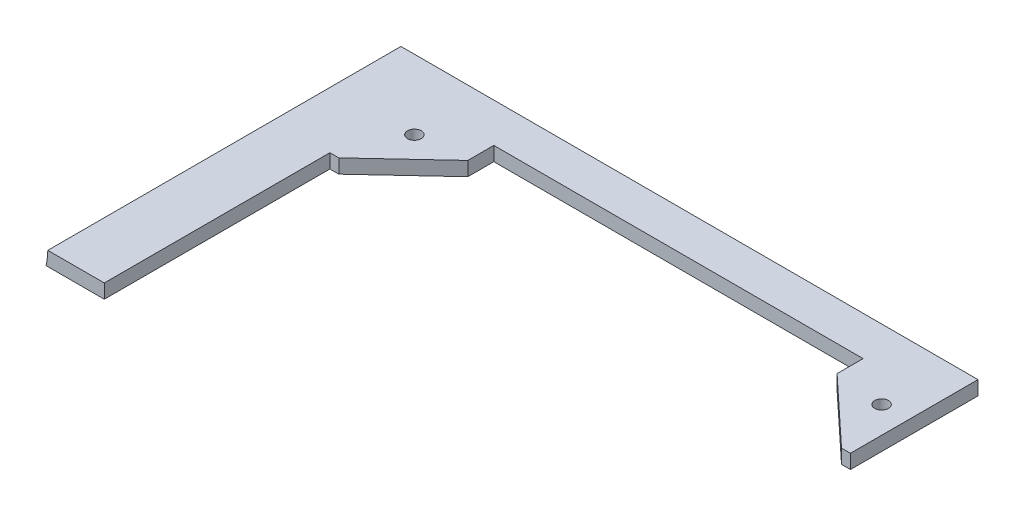
ISO-10303-21;
HEADER;
FILE_DESCRIPTION(('STEP AP214'),'2;1');
FILE_NAME('part.step','',(''),(''),'','','');
FILE_SCHEMA(('AUTOMOTIVE_DESIGN { 1 0 10303 214 1 1 1 1 }'));
ENDSEC;
DATA;
#1=APPLICATION_CONTEXT('core data for automotive mechanical design processes');
#2=APPLICATION_PROTOCOL_DEFINITION('international standard','automotive_design',2000,#1);
#3=PRODUCT_CONTEXT('',#1,'mechanical');
#4=PRODUCT('Part','Part','',(#3));
#5=PRODUCT_RELATED_PRODUCT_CATEGORY('part','',(#4));
#6=PRODUCT_DEFINITION_FORMATION('','',#4);
#7=PRODUCT_DEFINITION_CONTEXT('part definition',#1,'design');
#8=PRODUCT_DEFINITION('design','',#6,#7);
#9=PRODUCT_DEFINITION_SHAPE('','',#8);
#10=(LENGTH_UNIT() NAMED_UNIT(*) SI_UNIT(.MILLI.,.METRE.));
#11=(NAMED_UNIT(*) PLANE_ANGLE_UNIT() SI_UNIT($,.RADIAN.));
#12=(NAMED_UNIT(*) SI_UNIT($,.STERADIAN.) SOLID_ANGLE_UNIT());
#13=UNCERTAINTY_MEASURE_WITH_UNIT(LENGTH_MEASURE(1.E-05),#10,'distance_accuracy_value','');
#14=(GEOMETRIC_REPRESENTATION_CONTEXT(3) GLOBAL_UNCERTAINTY_ASSIGNED_CONTEXT((#13)) GLOBAL_UNIT_ASSIGNED_CONTEXT((#10,
#11,#12)) REPRESENTATION_CONTEXT('',''));
#15=CARTESIAN_POINT('',(0.,0.,0.));
#16=DIRECTION('',(0.,0.,1.));
#17=DIRECTION('',(1.,0.,0.));
#18=AXIS2_PLACEMENT_3D('',#15,#16,#17);
#19=CARTESIAN_POINT('',(0.,3.175,0.));
#20=DIRECTION('',(0.,-1.,0.));
#21=DIRECTION('',(0.,0.,-1.));
#22=AXIS2_PLACEMENT_3D('',#19,#20,#21);
#23=PLANE('',#22);
#24=CARTESIAN_POINT('',(-52.505245515811,3.175,-25.6052455158436));
#25=DIRECTION('',(0.,1.,0.));
#26=DIRECTION('',(0.,0.,1.));
#27=AXIS2_PLACEMENT_3D('',#24,#25,#26);
#28=CIRCLE('',#27,1.54533666301317);
#29=CARTESIAN_POINT('',(-52.505245515811,3.175,-24.0599088528304));
#30=VERTEX_POINT('',#29);
#31=EDGE_CURVE('E310',#30,#30,#28,.T.);
#32=ORIENTED_EDGE('',*,*,#31,.F.);
#33=EDGE_LOOP('',(#32));
#34=FACE_BOUND('',#33,.T.);
#35=CARTESIAN_POINT('',(52.5000000000001,3.175,-25.6052455158436));
#36=DIRECTION('',(0.,1.,0.));
#37=DIRECTION('',(0.,0.,1.));
#38=AXIS2_PLACEMENT_3D('',#35,#36,#37);
#39=CIRCLE('',#38,1.54533666301317);
#40=CARTESIAN_POINT('',(52.5000000000001,3.175,-24.0599088528304));
#41=VERTEX_POINT('',#40);
#42=EDGE_CURVE('E319',#41,#41,#39,.T.);
#43=ORIENTED_EDGE('',*,*,#42,.F.);
#44=EDGE_LOOP('',(#43));
#45=FACE_BOUND('',#44,.T.);
#46=DIRECTION('',(0.,0.,-1.));
#47=VECTOR('',#46,1.);
#48=CARTESIAN_POINT('',(-71.1999999999997,3.175,467.88391263662));
#49=LINE('',#48,#47);
#50=CARTESIAN_POINT('',(-71.1999999999999,3.175,38.1));
#51=VERTEX_POINT('',#50);
#52=CARTESIAN_POINT('',(-71.1999999999999,3.17500000006794,-36.6546307938387));
#53=VERTEX_POINT('',#52);
#54=EDGE_CURVE('E275',#51,#53,#49,.T.);
#55=ORIENTED_EDGE('',*,*,#54,.F.);
#56=DIRECTION('',(1.,0.,0.));
#57=VECTOR('',#56,1.);
#58=CARTESIAN_POINT('',(-76.2,3.175,38.1));
#59=LINE('',#58,#57);
#60=CARTESIAN_POINT('',(-58.4999999999998,3.175,38.1));
#61=VERTEX_POINT('',#60);
#62=EDGE_CURVE('E416',#51,#61,#59,.T.);
#63=ORIENTED_EDGE('',*,*,#62,.T.);
#64=DIRECTION('',(0.,0.,1.));
#65=VECTOR('',#64,1.);
#66=CARTESIAN_POINT('',(-58.4999999999998,3.175,0.));
#67=LINE('',#66,#65);
#68=CARTESIAN_POINT('',(-58.4999999999998,3.175,-12.6000000000291));
#69=VERTEX_POINT('',#68);
#70=EDGE_CURVE('E360',#69,#61,#67,.T.);
#71=ORIENTED_EDGE('',*,*,#70,.F.);
#72=DIRECTION('',(-1.,0.,0.));
#73=VECTOR('',#72,1.);
#74=CARTESIAN_POINT('',(0.,3.175,-12.6000000000289));
#75=LINE('',#74,#73);
#76=CARTESIAN_POINT('',(-56.4999999999998,3.175,-12.6000000000291));
#77=VERTEX_POINT('',#76);
#78=EDGE_CURVE('E314',#77,#69,#75,.T.);
#79=ORIENTED_EDGE('',*,*,#78,.F.);
#80=DIRECTION('',(0.731055268242868,0.,-0.682318250360012));
#81=VECTOR('',#80,1.);
#82=CARTESIAN_POINT('',(-32.5890736342187,3.175,-34.9168646080915));
#83=LINE('',#82,#81);
#84=CARTESIAN_POINT('',(-41.4999999999998,3.175,-26.6000000000291));
#85=VERTEX_POINT('',#84);
#86=EDGE_CURVE('E331',#77,#85,#83,.T.);
#87=ORIENTED_EDGE('',*,*,#86,.T.);
#88=DIRECTION('',(0.,0.,-1.));
#89=VECTOR('',#88,1.);
#90=CARTESIAN_POINT('',(-41.4999999999998,3.175,0.));
#91=LINE('',#90,#89);
#92=CARTESIAN_POINT('',(-41.4999999999998,3.175,-32.4500000000291));
#93=VERTEX_POINT('',#92);
#94=EDGE_CURVE('E383',#85,#93,#91,.T.);
#95=ORIENTED_EDGE('',*,*,#94,.T.);
#96=DIRECTION('',(1.,0.,0.));
#97=VECTOR('',#96,1.);
#98=CARTESIAN_POINT('',(0.,3.175,-32.4500000000291));
#99=LINE('',#98,#97);
#100=CARTESIAN_POINT('',(41.5000000000002,3.175,-32.4500000000291));
#101=VERTEX_POINT('',#100);
#102=EDGE_CURVE('E379',#93,#101,#99,.T.);
#103=ORIENTED_EDGE('',*,*,#102,.T.);
#104=DIRECTION('',(0.,0.,1.));
#105=VECTOR('',#104,1.);
#106=CARTESIAN_POINT('',(41.5000000000002,3.175,0.));
#107=LINE('',#106,#105);
#108=CARTESIAN_POINT('',(41.5000000000002,3.175,-26.6000000000291));
#109=VERTEX_POINT('',#108);
#110=EDGE_CURVE('E375',#101,#109,#107,.T.);
#111=ORIENTED_EDGE('',*,*,#110,.T.);
#112=DIRECTION('',(0.731055268242869,0.,0.682318250360011));
#113=VECTOR('',#112,1.);
#114=CARTESIAN_POINT('',(32.5890736342188,3.175,-34.9168646080917));
#115=LINE('',#114,#113);
#116=CARTESIAN_POINT('',(56.5000000000002,3.175,-12.6000000000291));
#117=VERTEX_POINT('',#116);
#118=EDGE_CURVE('E371',#109,#117,#115,.T.);
#119=ORIENTED_EDGE('',*,*,#118,.T.);
#120=DIRECTION('',(1.,0.,0.));
#121=VECTOR('',#120,1.);
#122=CARTESIAN_POINT('',(0.,3.175,-12.6000000000291));
#123=LINE('',#122,#121);
#124=CARTESIAN_POINT('',(58.5000000000002,3.175,-12.6000000000291));
#125=VERTEX_POINT('',#124);
#126=EDGE_CURVE('E367',#117,#125,#123,.T.);
#127=ORIENTED_EDGE('',*,*,#126,.T.);
#128=DIRECTION('',(0.,0.,-1.));
#129=VECTOR('',#128,1.);
#130=CARTESIAN_POINT('',(58.5000000000002,3.175,0.));
#131=LINE('',#130,#129);
#132=CARTESIAN_POINT('',(58.5000000000002,3.175,-41.275));
#133=VERTEX_POINT('',#132);
#134=EDGE_CURVE('E364',#125,#133,#131,.T.);
#135=ORIENTED_EDGE('',*,*,#134,.T.);
#136=DIRECTION('',(1.,0.,0.));
#137=VECTOR('',#136,1.);
#138=CARTESIAN_POINT('',(-76.2,3.175,-41.275));
#139=LINE('',#138,#137);
#140=CARTESIAN_POINT('',(-71.2,3.175,-41.275));
#141=VERTEX_POINT('',#140);
#142=EDGE_CURVE('E282',#141,#133,#139,.T.);
#143=ORIENTED_EDGE('',*,*,#142,.F.);
#144=DIRECTION('',(0.,0.,-1.));
#145=VECTOR('',#144,1.);
#146=CARTESIAN_POINT('',(-71.2,3.175,-36.6546307938386));
#147=LINE('',#146,#145);
#148=EDGE_CURVE('E193',#53,#141,#147,.T.);
#149=ORIENTED_EDGE('',*,*,#148,.F.);
#150=EDGE_LOOP('',(#55,#63,#71,#79,#87,#95,#103,#111,#119,#127,#135,#143,#149));
#151=FACE_BOUND('',#150,.T.);
#152=ADVANCED_FACE('F177',(#34,#45,#151),#23,.F.);
#153=CARTESIAN_POINT('',(0.,0.,0.));
#154=DIRECTION('',(0.,-1.,0.));
#155=DIRECTION('',(0.,0.,-1.));
#156=AXIS2_PLACEMENT_3D('',#153,#154,#155);
#157=PLANE('',#156);
#158=CARTESIAN_POINT('',(52.5000000000001,0.,-25.6052455158436));
#159=DIRECTION('',(0.,1.,0.));
#160=DIRECTION('',(0.,0.,1.));
#161=AXIS2_PLACEMENT_3D('',#158,#159,#160);
#162=CIRCLE('',#161,1.54533666301317);
#163=CARTESIAN_POINT('',(52.5000000000001,0.,-24.0599088528304));
#164=VERTEX_POINT('',#163);
#165=EDGE_CURVE('E309',#164,#164,#162,.T.);
#166=ORIENTED_EDGE('',*,*,#165,.T.);
#167=EDGE_LOOP('',(#166));
#168=FACE_BOUND('',#167,.T.);
#169=CARTESIAN_POINT('',(-52.505245515811,0.,-25.6052455158436));
#170=DIRECTION('',(0.,1.,0.));
#171=DIRECTION('',(0.,0.,1.));
#172=AXIS2_PLACEMENT_3D('',#169,#170,#171);
#173=CIRCLE('',#172,1.54533666301317);
#174=CARTESIAN_POINT('',(-52.505245515811,0.,-24.0599088528304));
#175=VERTEX_POINT('',#174);
#176=EDGE_CURVE('E315',#175,#175,#173,.T.);
#177=ORIENTED_EDGE('',*,*,#176,.T.);
#178=EDGE_LOOP('',(#177));
#179=FACE_BOUND('',#178,.T.);
#180=DIRECTION('',(1.,0.,0.));
#181=VECTOR('',#180,1.);
#182=CARTESIAN_POINT('',(-76.2,0.,38.1));
#183=LINE('',#182,#181);
#184=CARTESIAN_POINT('',(-71.6032778758089,0.,38.1));
#185=VERTEX_POINT('',#184);
#186=CARTESIAN_POINT('',(-58.4999999999998,0.,38.1));
#187=VERTEX_POINT('',#186);
#188=EDGE_CURVE('E201',#185,#187,#183,.T.);
#189=ORIENTED_EDGE('',*,*,#188,.F.);
#190=DIRECTION('',(0.,0.,-1.));
#191=VECTOR('',#190,1.);
#192=CARTESIAN_POINT('',(-71.6032778758086,0.,467.88391263662));
#193=LINE('',#192,#191);
#194=CARTESIAN_POINT('',(-71.6032778758089,0.,-36.6546307938387));
#195=VERTEX_POINT('',#194);
#196=EDGE_CURVE('E283',#185,#195,#193,.T.);
#197=ORIENTED_EDGE('',*,*,#196,.T.);
#198=DIRECTION('',(0.,0.,-1.));
#199=VECTOR('',#198,1.);
#200=CARTESIAN_POINT('',(-71.603277875809,0.,-36.6546307938386));
#201=LINE('',#200,#199);
#202=CARTESIAN_POINT('',(-71.603277875809,0.,-41.275));
#203=VERTEX_POINT('',#202);
#204=EDGE_CURVE('E287',#195,#203,#201,.T.);
#205=ORIENTED_EDGE('',*,*,#204,.T.);
#206=DIRECTION('',(-1.,0.,0.));
#207=VECTOR('',#206,1.);
#208=CARTESIAN_POINT('',(58.5000000000002,0.,-41.275));
#209=LINE('',#208,#207);
#210=CARTESIAN_POINT('',(58.5000000000002,0.,-41.275));
#211=VERTEX_POINT('',#210);
#212=EDGE_CURVE('E305',#211,#203,#209,.T.);
#213=ORIENTED_EDGE('',*,*,#212,.F.);
#214=DIRECTION('',(0.,0.,-1.));
#215=VECTOR('',#214,1.);
#216=CARTESIAN_POINT('',(58.5000000000002,0.,0.));
#217=LINE('',#216,#215);
#218=CARTESIAN_POINT('',(58.5000000000002,0.,-12.6000000000291));
#219=VERTEX_POINT('',#218);
#220=EDGE_CURVE('E335',#219,#211,#217,.T.);
#221=ORIENTED_EDGE('',*,*,#220,.F.);
#222=DIRECTION('',(1.,0.,0.));
#223=VECTOR('',#222,1.);
#224=CARTESIAN_POINT('',(0.,0.,-12.6000000000291));
#225=LINE('',#224,#223);
#226=CARTESIAN_POINT('',(56.5000000000002,0.,-12.6000000000291));
#227=VERTEX_POINT('',#226);
#228=EDGE_CURVE('E338',#227,#219,#225,.T.);
#229=ORIENTED_EDGE('',*,*,#228,.F.);
#230=DIRECTION('',(0.731055268242869,0.,0.682318250360011));
#231=VECTOR('',#230,1.);
#232=CARTESIAN_POINT('',(32.5890736342188,0.,-34.9168646080917));
#233=LINE('',#232,#231);
#234=CARTESIAN_POINT('',(41.5000000000002,0.,-26.6000000000291));
#235=VERTEX_POINT('',#234);
#236=EDGE_CURVE('E341',#235,#227,#233,.T.);
#237=ORIENTED_EDGE('',*,*,#236,.F.);
#238=DIRECTION('',(0.,0.,1.));
#239=VECTOR('',#238,1.);
#240=CARTESIAN_POINT('',(41.5000000000002,0.,0.));
#241=LINE('',#240,#239);
#242=CARTESIAN_POINT('',(41.5000000000002,0.,-32.4500000000291));
#243=VERTEX_POINT('',#242);
#244=EDGE_CURVE('E344',#243,#235,#241,.T.);
#245=ORIENTED_EDGE('',*,*,#244,.F.);
#246=DIRECTION('',(1.,0.,0.));
#247=VECTOR('',#246,1.);
#248=CARTESIAN_POINT('',(0.,0.,-32.4500000000291));
#249=LINE('',#248,#247);
#250=CARTESIAN_POINT('',(-41.4999999999998,0.,-32.4500000000291));
#251=VERTEX_POINT('',#250);
#252=EDGE_CURVE('E347',#251,#243,#249,.T.);
#253=ORIENTED_EDGE('',*,*,#252,.F.);
#254=DIRECTION('',(0.,0.,-1.));
#255=VECTOR('',#254,1.);
#256=CARTESIAN_POINT('',(-41.4999999999998,0.,0.));
#257=LINE('',#256,#255);
#258=CARTESIAN_POINT('',(-41.4999999999998,0.,-26.6000000000291));
#259=VERTEX_POINT('',#258);
#260=EDGE_CURVE('E350',#259,#251,#257,.T.);
#261=ORIENTED_EDGE('',*,*,#260,.F.);
#262=DIRECTION('',(0.731055268242868,0.,-0.682318250360012));
#263=VECTOR('',#262,1.);
#264=CARTESIAN_POINT('',(-32.5890736342187,0.,-34.9168646080915));
#265=LINE('',#264,#263);
#266=CARTESIAN_POINT('',(-56.4999999999998,0.,-12.6000000000291));
#267=VERTEX_POINT('',#266);
#268=EDGE_CURVE('E353',#267,#259,#265,.T.);
#269=ORIENTED_EDGE('',*,*,#268,.F.);
#270=DIRECTION('',(-1.,0.,0.));
#271=VECTOR('',#270,1.);
#272=CARTESIAN_POINT('',(0.,0.,-12.6000000000289));
#273=LINE('',#272,#271);
#274=CARTESIAN_POINT('',(-58.4999999999998,0.,-12.6000000000291));
#275=VERTEX_POINT('',#274);
#276=EDGE_CURVE('E326',#267,#275,#273,.T.);
#277=ORIENTED_EDGE('',*,*,#276,.T.);
#278=DIRECTION('',(0.,0.,1.));
#279=VECTOR('',#278,1.);
#280=CARTESIAN_POINT('',(-58.4999999999998,0.,0.));
#281=LINE('',#280,#279);
#282=EDGE_CURVE('E330',#275,#187,#281,.T.);
#283=ORIENTED_EDGE('',*,*,#282,.T.);
#284=EDGE_LOOP('',(#189,#197,#205,#213,#221,#229,#237,#245,#253,#261,#269,#277,#283));
#285=FACE_BOUND('',#284,.T.);
#286=ADVANCED_FACE('F425',(#168,#179,#285),#157,.T.);
#287=CARTESIAN_POINT('',(-76.2,3.175,38.1));
#288=DIRECTION('',(0.,0.,-1.));
#289=DIRECTION('',(-1.,0.,0.));
#290=AXIS2_PLACEMENT_3D('',#287,#288,#289);
#291=PLANE('',#290);
#292=CARTESIAN_POINT('',(-83.8999999999999,3.17500000006792,38.1));
#293=DIRECTION('',(0.,0.,-1.));
#294=DIRECTION('',(-1.,0.,0.));
#295=AXIS2_PLACEMENT_3D('',#292,#293,#294);
#296=CIRCLE('',#295,12.7);
#297=EDGE_CURVE('E12',#185,#51,#296,.F.);
#298=ORIENTED_EDGE('',*,*,#297,.F.);
#299=ORIENTED_EDGE('',*,*,#188,.T.);
#300=DIRECTION('',(0.,1.,0.));
#301=VECTOR('',#300,1.);
#302=CARTESIAN_POINT('',(-58.4999999999998,0.,38.1));
#303=LINE('',#302,#301);
#304=EDGE_CURVE('E411',#187,#61,#303,.T.);
#305=ORIENTED_EDGE('',*,*,#304,.T.);
#306=ORIENTED_EDGE('',*,*,#62,.F.);
#307=EDGE_LOOP('',(#298,#299,#305,#306));
#308=FACE_BOUND('',#307,.T.);
#309=ADVANCED_FACE('F179',(#308),#291,.F.);
#310=CARTESIAN_POINT('',(0.,0.,-12.6000000000289));
#311=DIRECTION('',(0.,0.,-1.));
#312=DIRECTION('',(-1.,0.,0.));
#313=AXIS2_PLACEMENT_3D('',#310,#311,#312);
#314=PLANE('',#313);
#315=ORIENTED_EDGE('',*,*,#78,.T.);
#316=DIRECTION('',(0.,1.,0.));
#317=VECTOR('',#316,1.);
#318=CARTESIAN_POINT('',(-58.4999999999998,0.,-12.6000000000291));
#319=LINE('',#318,#317);
#320=EDGE_CURVE('E356',#275,#69,#319,.T.);
#321=ORIENTED_EDGE('',*,*,#320,.F.);
#322=ORIENTED_EDGE('',*,*,#276,.F.);
#323=DIRECTION('',(0.,1.,0.));
#324=VECTOR('',#323,1.);
#325=CARTESIAN_POINT('',(-56.4999999999998,0.,-12.6000000000291));
#326=LINE('',#325,#324);
#327=EDGE_CURVE('E390',#267,#77,#326,.T.);
#328=ORIENTED_EDGE('',*,*,#327,.T.);
#329=EDGE_LOOP('',(#315,#321,#322,#328));
#330=FACE_BOUND('',#329,.T.);
#331=ADVANCED_FACE('F434',(#330),#314,.F.);
#332=CARTESIAN_POINT('',(-32.5890736342187,0.,-34.9168646080915));
#333=DIRECTION('',(0.682318250360012,0.,0.731055268242868));
#334=DIRECTION('',(0.731055268242869,0.,-0.682318250360012));
#335=AXIS2_PLACEMENT_3D('',#332,#333,#334);
#336=PLANE('',#335);
#337=ORIENTED_EDGE('',*,*,#86,.F.);
#338=ORIENTED_EDGE('',*,*,#327,.F.);
#339=ORIENTED_EDGE('',*,*,#268,.T.);
#340=DIRECTION('',(0.,1.,0.));
#341=VECTOR('',#340,1.);
#342=CARTESIAN_POINT('',(-41.4999999999998,0.,-26.6000000000291));
#343=LINE('',#342,#341);
#344=EDGE_CURVE('E393',#259,#85,#343,.T.);
#345=ORIENTED_EDGE('',*,*,#344,.T.);
#346=EDGE_LOOP('',(#337,#338,#339,#345));
#347=FACE_BOUND('',#346,.T.);
#348=ADVANCED_FACE('F438',(#347),#336,.T.);
#349=CARTESIAN_POINT('',(-41.4999999999998,0.,0.));
#350=DIRECTION('',(1.,0.,0.));
#351=DIRECTION('',(0.,0.,-1.));
#352=AXIS2_PLACEMENT_3D('',#349,#350,#351);
#353=PLANE('',#352);
#354=ORIENTED_EDGE('',*,*,#94,.F.);
#355=ORIENTED_EDGE('',*,*,#344,.F.);
#356=ORIENTED_EDGE('',*,*,#260,.T.);
#357=DIRECTION('',(0.,1.,0.));
#358=VECTOR('',#357,1.);
#359=CARTESIAN_POINT('',(-41.4999999999998,0.,-32.4500000000291));
#360=LINE('',#359,#358);
#361=EDGE_CURVE('E396',#251,#93,#360,.T.);
#362=ORIENTED_EDGE('',*,*,#361,.T.);
#363=EDGE_LOOP('',(#354,#355,#356,#362));
#364=FACE_BOUND('',#363,.T.);
#365=ADVANCED_FACE('F443',(#364),#353,.T.);
#366=CARTESIAN_POINT('',(0.,0.,-32.4500000000291));
#367=DIRECTION('',(0.,0.,1.));
#368=DIRECTION('',(1.,0.,0.));
#369=AXIS2_PLACEMENT_3D('',#366,#367,#368);
#370=PLANE('',#369);
#371=ORIENTED_EDGE('',*,*,#102,.F.);
#372=ORIENTED_EDGE('',*,*,#361,.F.);
#373=ORIENTED_EDGE('',*,*,#252,.T.);
#374=DIRECTION('',(0.,1.,0.));
#375=VECTOR('',#374,1.);
#376=CARTESIAN_POINT('',(41.5000000000002,0.,-32.4500000000291));
#377=LINE('',#376,#375);
#378=EDGE_CURVE('E399',#243,#101,#377,.T.);
#379=ORIENTED_EDGE('',*,*,#378,.T.);
#380=EDGE_LOOP('',(#371,#372,#373,#379));
#381=FACE_BOUND('',#380,.T.);
#382=ADVANCED_FACE('F448',(#381),#370,.T.);
#383=CARTESIAN_POINT('',(41.5000000000002,0.,0.));
#384=DIRECTION('',(-1.,0.,0.));
#385=DIRECTION('',(0.,0.,1.));
#386=AXIS2_PLACEMENT_3D('',#383,#384,#385);
#387=PLANE('',#386);
#388=ORIENTED_EDGE('',*,*,#110,.F.);
#389=ORIENTED_EDGE('',*,*,#378,.F.);
#390=ORIENTED_EDGE('',*,*,#244,.T.);
#391=DIRECTION('',(0.,1.,0.));
#392=VECTOR('',#391,1.);
#393=CARTESIAN_POINT('',(41.5000000000002,0.,-26.6000000000291));
#394=LINE('',#393,#392);
#395=EDGE_CURVE('E402',#235,#109,#394,.T.);
#396=ORIENTED_EDGE('',*,*,#395,.T.);
#397=EDGE_LOOP('',(#388,#389,#390,#396));
#398=FACE_BOUND('',#397,.T.);
#399=ADVANCED_FACE('F453',(#398),#387,.T.);
#400=CARTESIAN_POINT('',(32.5890736342188,0.,-34.9168646080917));
#401=DIRECTION('',(-0.682318250360011,0.,0.731055268242869));
#402=DIRECTION('',(0.731055268242869,0.,0.682318250360011));
#403=AXIS2_PLACEMENT_3D('',#400,#401,#402);
#404=PLANE('',#403);
#405=ORIENTED_EDGE('',*,*,#118,.F.);
#406=ORIENTED_EDGE('',*,*,#395,.F.);
#407=ORIENTED_EDGE('',*,*,#236,.T.);
#408=DIRECTION('',(0.,1.,0.));
#409=VECTOR('',#408,1.);
#410=CARTESIAN_POINT('',(56.5000000000002,0.,-12.6000000000291));
#411=LINE('',#410,#409);
#412=EDGE_CURVE('E405',#227,#117,#411,.T.);
#413=ORIENTED_EDGE('',*,*,#412,.T.);
#414=EDGE_LOOP('',(#405,#406,#407,#413));
#415=FACE_BOUND('',#414,.T.);
#416=ADVANCED_FACE('F458',(#415),#404,.T.);
#417=CARTESIAN_POINT('',(0.,0.,-12.6000000000291));
#418=DIRECTION('',(0.,0.,1.));
#419=DIRECTION('',(1.,0.,0.));
#420=AXIS2_PLACEMENT_3D('',#417,#418,#419);
#421=PLANE('',#420);
#422=ORIENTED_EDGE('',*,*,#126,.F.);
#423=ORIENTED_EDGE('',*,*,#412,.F.);
#424=ORIENTED_EDGE('',*,*,#228,.T.);
#425=DIRECTION('',(0.,1.,0.));
#426=VECTOR('',#425,1.);
#427=CARTESIAN_POINT('',(58.5000000000002,0.,-12.6000000000291));
#428=LINE('',#427,#426);
#429=EDGE_CURVE('E408',#219,#125,#428,.T.);
#430=ORIENTED_EDGE('',*,*,#429,.T.);
#431=EDGE_LOOP('',(#422,#423,#424,#430));
#432=FACE_BOUND('',#431,.T.);
#433=ADVANCED_FACE('F463',(#432),#421,.T.);
#434=CARTESIAN_POINT('',(58.5000000000002,0.,0.));
#435=DIRECTION('',(1.,0.,0.));
#436=DIRECTION('',(0.,0.,-1.));
#437=AXIS2_PLACEMENT_3D('',#434,#435,#436);
#438=PLANE('',#437);
#439=ORIENTED_EDGE('',*,*,#134,.F.);
#440=ORIENTED_EDGE('',*,*,#429,.F.);
#441=ORIENTED_EDGE('',*,*,#220,.T.);
#442=DIRECTION('',(0.,-1.,0.));
#443=VECTOR('',#442,1.);
#444=CARTESIAN_POINT('',(58.5000000000002,3.175,-41.275));
#445=LINE('',#444,#443);
#446=EDGE_CURVE('E301',#133,#211,#445,.T.);
#447=ORIENTED_EDGE('',*,*,#446,.F.);
#448=EDGE_LOOP('',(#439,#440,#441,#447));
#449=FACE_BOUND('',#448,.T.);
#450=ADVANCED_FACE('F468',(#449),#438,.T.);
#451=CARTESIAN_POINT('',(-58.4999999999998,0.,0.));
#452=DIRECTION('',(-1.,0.,0.));
#453=DIRECTION('',(0.,0.,1.));
#454=AXIS2_PLACEMENT_3D('',#451,#452,#453);
#455=PLANE('',#454);
#456=ORIENTED_EDGE('',*,*,#70,.T.);
#457=ORIENTED_EDGE('',*,*,#304,.F.);
#458=ORIENTED_EDGE('',*,*,#282,.F.);
#459=ORIENTED_EDGE('',*,*,#320,.T.);
#460=EDGE_LOOP('',(#456,#457,#458,#459));
#461=FACE_BOUND('',#460,.T.);
#462=ADVANCED_FACE('F430',(#461),#455,.F.);
#463=CARTESIAN_POINT('',(-52.505245515811,0.,-25.6052455158436));
#464=DIRECTION('',(0.,1.,0.));
#465=DIRECTION('',(0.,0.,1.));
#466=AXIS2_PLACEMENT_3D('',#463,#464,#465);
#467=CYLINDRICAL_SURFACE('',#466,1.54533666301317);
#468=ORIENTED_EDGE('',*,*,#176,.F.);
#469=EDGE_LOOP('',(#468));
#470=FACE_BOUND('',#469,.T.);
#471=ORIENTED_EDGE('',*,*,#31,.T.);
#472=EDGE_LOOP('',(#471));
#473=FACE_BOUND('',#472,.T.);
#474=ADVANCED_FACE('F476',(#470,#473),#467,.F.);
#475=CARTESIAN_POINT('',(52.5000000000001,0.,-25.6052455158436));
#476=DIRECTION('',(0.,1.,0.));
#477=DIRECTION('',(0.,0.,1.));
#478=AXIS2_PLACEMENT_3D('',#475,#476,#477);
#479=CYLINDRICAL_SURFACE('',#478,1.54533666301317);
#480=ORIENTED_EDGE('',*,*,#165,.F.);
#481=EDGE_LOOP('',(#480));
#482=FACE_BOUND('',#481,.T.);
#483=ORIENTED_EDGE('',*,*,#42,.T.);
#484=EDGE_LOOP('',(#483));
#485=FACE_BOUND('',#484,.T.);
#486=ADVANCED_FACE('F505',(#482,#485),#479,.F.);
#487=CARTESIAN_POINT('',(0.,0.,-41.275));
#488=DIRECTION('',(0.,0.,-1.));
#489=DIRECTION('',(-1.,0.,0.));
#490=AXIS2_PLACEMENT_3D('',#487,#488,#489);
#491=PLANE('',#490);
#492=ORIENTED_EDGE('',*,*,#212,.T.);
#493=CARTESIAN_POINT('',(-83.9,3.17500000006798,-41.275));
#494=DIRECTION('',(0.,0.,-1.));
#495=DIRECTION('',(-1.,0.,0.));
#496=AXIS2_PLACEMENT_3D('',#493,#494,#495);
#497=CIRCLE('',#496,12.7);
#498=EDGE_CURVE('E186',#203,#141,#497,.F.);
#499=ORIENTED_EDGE('',*,*,#498,.T.);
#500=ORIENTED_EDGE('',*,*,#142,.T.);
#501=ORIENTED_EDGE('',*,*,#446,.T.);
#502=EDGE_LOOP('',(#492,#499,#500,#501));
#503=FACE_BOUND('',#502,.T.);
#504=ADVANCED_FACE('F422',(#503),#491,.T.);
#505=CARTESIAN_POINT('',(-83.8999999999997,3.1750000000678,467.88391263662));
#506=DIRECTION('',(0.,0.,-1.));
#507=DIRECTION('',(-1.,0.,0.));
#508=AXIS2_PLACEMENT_3D('',#505,#506,#507);
#509=CYLINDRICAL_SURFACE('',#508,12.7);
#510=ORIENTED_EDGE('',*,*,#54,.T.);
#511=CARTESIAN_POINT('',(-83.8999999999999,3.17500000006794,-36.6546307938387));
#512=DIRECTION('',(0.,0.,1.));
#513=DIRECTION('',(1.,0.,0.));
#514=AXIS2_PLACEMENT_3D('',#511,#512,#513);
#515=CIRCLE('',#514,12.7);
#516=EDGE_CURVE('E277',#195,#53,#515,.T.);
#517=ORIENTED_EDGE('',*,*,#516,.F.);
#518=ORIENTED_EDGE('',*,*,#196,.F.);
#519=ORIENTED_EDGE('',*,*,#297,.T.);
#520=EDGE_LOOP('',(#510,#517,#518,#519));
#521=FACE_BOUND('',#520,.T.);
#522=ADVANCED_FACE('F276',(#521),#509,.F.);
#523=CARTESIAN_POINT('',(-83.9,3.17500000006798,-36.6546307938386));
#524=DIRECTION('',(0.,0.,-1.));
#525=DIRECTION('',(-1.,0.,0.));
#526=AXIS2_PLACEMENT_3D('',#523,#524,#525);
#527=CYLINDRICAL_SURFACE('',#526,12.7);
#528=ORIENTED_EDGE('',*,*,#148,.T.);
#529=ORIENTED_EDGE('',*,*,#498,.F.);
#530=ORIENTED_EDGE('',*,*,#204,.F.);
#531=ORIENTED_EDGE('',*,*,#516,.T.);
#532=EDGE_LOOP('',(#528,#529,#530,#531));
#533=FACE_BOUND('',#532,.T.);
#534=ADVANCED_FACE('F285',(#533),#527,.F.);
#535=CLOSED_SHELL('',(#152,#286,#309,#331,#348,#365,#382,#399,#416,#433,#450,#462,#474,#486,
#504,#522,#534));
#536=MANIFOLD_SOLID_BREP('B2',#535);
#537=ADVANCED_BREP_SHAPE_REPRESENTATION('',(#18,#536),#14);
#538=SHAPE_DEFINITION_REPRESENTATION(#9,#537);
ENDSEC;
END-ISO-10303-21;
